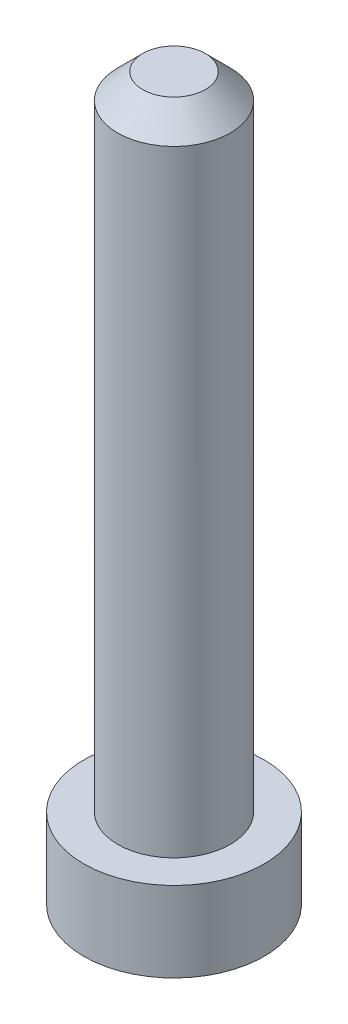
ISO-10303-21;
HEADER;
FILE_DESCRIPTION(('STEP AP214'),'2;1');
FILE_NAME('part.step','',(''),(''),'','','');
FILE_SCHEMA(('AUTOMOTIVE_DESIGN { 1 0 10303 214 1 1 1 1 }'));
ENDSEC;
DATA;
#1=APPLICATION_CONTEXT('core data for automotive mechanical design processes');
#2=APPLICATION_PROTOCOL_DEFINITION('international standard','automotive_design',2000,#1);
#3=PRODUCT_CONTEXT('',#1,'mechanical');
#4=PRODUCT('Part','Part','',(#3));
#5=PRODUCT_RELATED_PRODUCT_CATEGORY('part','',(#4));
#6=PRODUCT_DEFINITION_FORMATION('','',#4);
#7=PRODUCT_DEFINITION_CONTEXT('part definition',#1,'design');
#8=PRODUCT_DEFINITION('design','',#6,#7);
#9=PRODUCT_DEFINITION_SHAPE('','',#8);
#10=(LENGTH_UNIT() NAMED_UNIT(*) SI_UNIT(.MILLI.,.METRE.));
#11=(NAMED_UNIT(*) PLANE_ANGLE_UNIT() SI_UNIT($,.RADIAN.));
#12=(NAMED_UNIT(*) SI_UNIT($,.STERADIAN.) SOLID_ANGLE_UNIT());
#13=UNCERTAINTY_MEASURE_WITH_UNIT(LENGTH_MEASURE(1.E-05),#10,'distance_accuracy_value','');
#14=(GEOMETRIC_REPRESENTATION_CONTEXT(3) GLOBAL_UNCERTAINTY_ASSIGNED_CONTEXT((#13)) GLOBAL_UNIT_ASSIGNED_CONTEXT((#10,
#11,#12)) REPRESENTATION_CONTEXT('',''));
#15=CARTESIAN_POINT('',(0.,0.,0.));
#16=DIRECTION('',(0.,0.,1.));
#17=DIRECTION('',(1.,0.,0.));
#18=AXIS2_PLACEMENT_3D('',#15,#16,#17);
#19=CARTESIAN_POINT('',(0.5715,7.3152,0.));
#20=DIRECTION('',(0.,-1.,0.));
#21=DIRECTION('',(0.,0.,-1.));
#22=AXIS2_PLACEMENT_3D('',#19,#20,#21);
#23=PLANE('',#22);
#24=CARTESIAN_POINT('',(0.,7.3152,0.));
#25=DIRECTION('',(0.,-1.,0.));
#26=DIRECTION('',(0.,0.,-1.));
#27=AXIS2_PLACEMENT_3D('',#24,#25,#26);
#28=CIRCLE('',#27,0.3175);
#29=CARTESIAN_POINT('',(0.,7.3152,-0.3175));
#30=VERTEX_POINT('',#29);
#31=EDGE_CURVE('E38',#30,#30,#28,.F.);
#32=ORIENTED_EDGE('',*,*,#31,.T.);
#33=EDGE_LOOP('',(#32));
#34=FACE_BOUND('',#33,.T.);
#35=ADVANCED_FACE('F31',(#34),#23,.F.);
#36=CARTESIAN_POINT('',(0.,7.3152,0.));
#37=DIRECTION('',(0.,1.,0.));
#38=DIRECTION('',(0.,0.,1.));
#39=AXIS2_PLACEMENT_3D('',#36,#37,#38);
#40=CYLINDRICAL_SURFACE('',#39,0.5715);
#41=CARTESIAN_POINT('',(0.,7.0612,0.));
#42=DIRECTION('',(0.,-1.,0.));
#43=DIRECTION('',(0.,0.,-1.));
#44=AXIS2_PLACEMENT_3D('',#41,#42,#43);
#45=CIRCLE('',#44,0.5715);
#46=CARTESIAN_POINT('',(0.,7.0612,-0.5715));
#47=VERTEX_POINT('',#46);
#48=EDGE_CURVE('E10',#47,#47,#45,.T.);
#49=ORIENTED_EDGE('',*,*,#48,.T.);
#50=EDGE_LOOP('',(#49));
#51=FACE_BOUND('',#50,.T.);
#52=CARTESIAN_POINT('',(0.,0.812799999999999,0.));
#53=DIRECTION('',(0.,1.,0.));
#54=DIRECTION('',(0.,0.,1.));
#55=AXIS2_PLACEMENT_3D('',#52,#53,#54);
#56=CIRCLE('',#55,0.5715);
#57=CARTESIAN_POINT('',(0.,0.812799999999999,0.5715));
#58=VERTEX_POINT('',#57);
#59=EDGE_CURVE('E42',#58,#58,#56,.T.);
#60=ORIENTED_EDGE('',*,*,#59,.T.);
#61=EDGE_LOOP('',(#60));
#62=FACE_BOUND('',#61,.T.);
#63=ADVANCED_FACE('F69',(#51,#62),#40,.T.);
#64=CARTESIAN_POINT('',(0.9144,0.8128,0.));
#65=DIRECTION('',(0.,-1.,0.));
#66=DIRECTION('',(0.,0.,-1.));
#67=AXIS2_PLACEMENT_3D('',#64,#65,#66);
#68=PLANE('',#67);
#69=ORIENTED_EDGE('',*,*,#59,.F.);
#70=EDGE_LOOP('',(#69));
#71=FACE_BOUND('',#70,.T.);
#72=CARTESIAN_POINT('',(0.,0.8128,0.));
#73=DIRECTION('',(0.,1.,0.));
#74=DIRECTION('',(0.,0.,1.));
#75=AXIS2_PLACEMENT_3D('',#72,#73,#74);
#76=CIRCLE('',#75,0.9144);
#77=CARTESIAN_POINT('',(0.,0.8128,0.9144));
#78=VERTEX_POINT('',#77);
#79=EDGE_CURVE('E46',#78,#78,#76,.T.);
#80=ORIENTED_EDGE('',*,*,#79,.T.);
#81=EDGE_LOOP('',(#80));
#82=FACE_BOUND('',#81,.T.);
#83=ADVANCED_FACE('F65',(#71,#82),#68,.F.);
#84=CARTESIAN_POINT('',(0.,7.3152,0.));
#85=DIRECTION('',(0.,1.,0.));
#86=DIRECTION('',(0.,0.,1.));
#87=AXIS2_PLACEMENT_3D('',#84,#85,#86);
#88=CYLINDRICAL_SURFACE('',#87,0.9144);
#89=ORIENTED_EDGE('',*,*,#79,.F.);
#90=EDGE_LOOP('',(#89));
#91=FACE_BOUND('',#90,.T.);
#92=CARTESIAN_POINT('',(0.,0.,0.));
#93=DIRECTION('',(0.,1.,0.));
#94=DIRECTION('',(0.,0.,1.));
#95=AXIS2_PLACEMENT_3D('',#92,#93,#94);
#96=CIRCLE('',#95,0.9144);
#97=CARTESIAN_POINT('',(0.,0.,0.9144));
#98=VERTEX_POINT('',#97);
#99=EDGE_CURVE('E51',#98,#98,#96,.T.);
#100=ORIENTED_EDGE('',*,*,#99,.T.);
#101=EDGE_LOOP('',(#100));
#102=FACE_BOUND('',#101,.T.);
#103=ADVANCED_FACE('F55',(#91,#102),#88,.T.);
#104=CARTESIAN_POINT('',(0.9144,0.,0.));
#105=DIRECTION('',(0.,1.,0.));
#106=DIRECTION('',(0.,0.,1.));
#107=AXIS2_PLACEMENT_3D('',#104,#105,#106);
#108=PLANE('',#107);
#109=ORIENTED_EDGE('',*,*,#99,.F.);
#110=EDGE_LOOP('',(#109));
#111=FACE_BOUND('',#110,.T.);
#112=ADVANCED_FACE('F57',(#111),#108,.F.);
#113=CARTESIAN_POINT('',(0.,7.3152,0.));
#114=DIRECTION('',(0.,-1.,0.));
#115=DIRECTION('',(0.,0.,-1.));
#116=AXIS2_PLACEMENT_3D('',#113,#114,#115);
#117=CONICAL_SURFACE('',#116,0.3175,0.785398163397447);
#118=ORIENTED_EDGE('',*,*,#48,.F.);
#119=EDGE_LOOP('',(#118));
#120=FACE_BOUND('',#119,.T.);
#121=ORIENTED_EDGE('',*,*,#31,.F.);
#122=EDGE_LOOP('',(#121));
#123=FACE_BOUND('',#122,.T.);
#124=ADVANCED_FACE('F33',(#120,#123),#117,.T.);
#125=CLOSED_SHELL('',(#35,#63,#83,#103,#112,#124));
#126=MANIFOLD_SOLID_BREP('B2',#125);
#127=ADVANCED_BREP_SHAPE_REPRESENTATION('',(#18,#126),#14);
#128=SHAPE_DEFINITION_REPRESENTATION(#9,#127);
ENDSEC;
END-ISO-10303-21;
